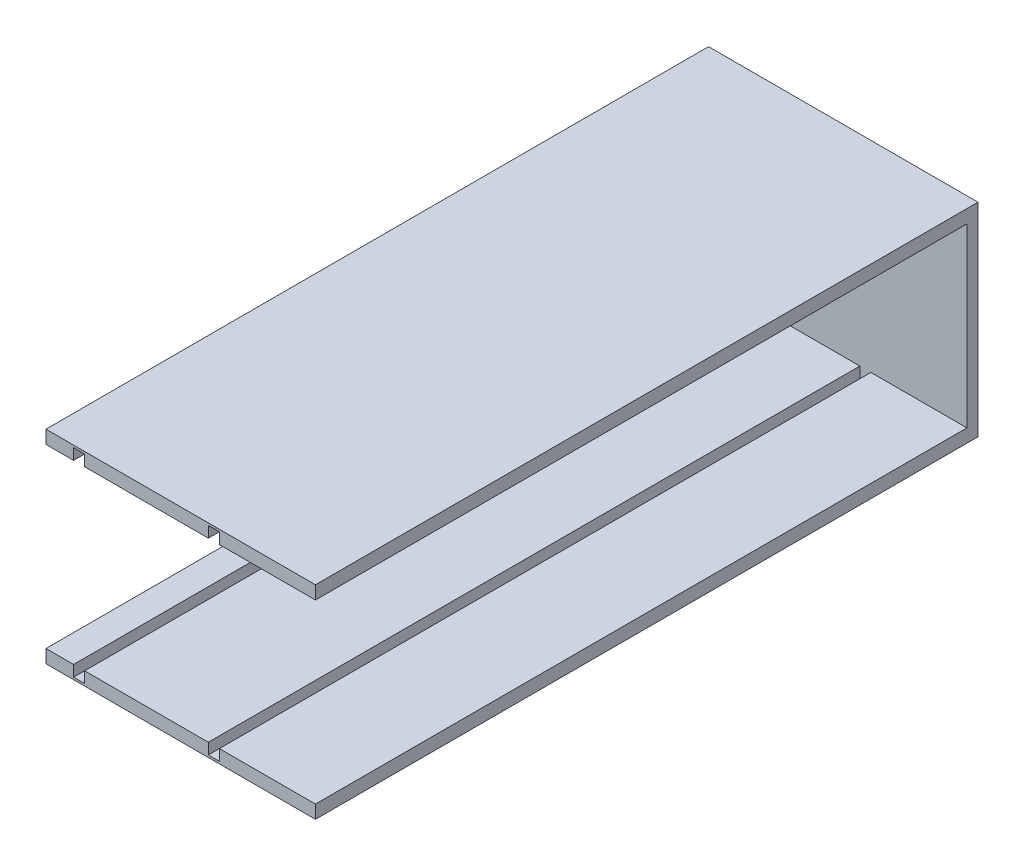
ISO-10303-21;
HEADER;
FILE_DESCRIPTION(('STEP AP214'),'2;1');
FILE_NAME('part.step','',(''),(''),'','','');
FILE_SCHEMA(('AUTOMOTIVE_DESIGN { 1 0 10303 214 1 1 1 1 }'));
ENDSEC;
DATA;
#1=APPLICATION_CONTEXT('core data for automotive mechanical design processes');
#2=APPLICATION_PROTOCOL_DEFINITION('international standard','automotive_design',2000,#1);
#3=PRODUCT_CONTEXT('',#1,'mechanical');
#4=PRODUCT('Part','Part','',(#3));
#5=PRODUCT_RELATED_PRODUCT_CATEGORY('part','',(#4));
#6=PRODUCT_DEFINITION_FORMATION('','',#4);
#7=PRODUCT_DEFINITION_CONTEXT('part definition',#1,'design');
#8=PRODUCT_DEFINITION('design','',#6,#7);
#9=PRODUCT_DEFINITION_SHAPE('','',#8);
#10=(LENGTH_UNIT() NAMED_UNIT(*) SI_UNIT(.MILLI.,.METRE.));
#11=(NAMED_UNIT(*) PLANE_ANGLE_UNIT() SI_UNIT($,.RADIAN.));
#12=(NAMED_UNIT(*) SI_UNIT($,.STERADIAN.) SOLID_ANGLE_UNIT());
#13=UNCERTAINTY_MEASURE_WITH_UNIT(LENGTH_MEASURE(1.E-05),#10,'distance_accuracy_value','');
#14=(GEOMETRIC_REPRESENTATION_CONTEXT(3) GLOBAL_UNCERTAINTY_ASSIGNED_CONTEXT((#13)) GLOBAL_UNIT_ASSIGNED_CONTEXT((#10,
#11,#12)) REPRESENTATION_CONTEXT('',''));
#15=CARTESIAN_POINT('',(0.,0.,0.));
#16=DIRECTION('',(0.,0.,1.));
#17=DIRECTION('',(1.,0.,0.));
#18=AXIS2_PLACEMENT_3D('',#15,#16,#17);
#19=CARTESIAN_POINT('',(0.,0.,25.));
#20=DIRECTION('',(0.,0.,1.));
#21=DIRECTION('',(1.,0.,0.));
#22=AXIS2_PLACEMENT_3D('',#19,#20,#21);
#23=PLANE('',#22);
#24=DIRECTION('',(0.,1.,0.));
#25=VECTOR('',#24,1.);
#26=CARTESIAN_POINT('',(-150.,0.,25.));
#27=LINE('',#26,#25);
#28=CARTESIAN_POINT('',(-150.,-430.,24.9999999999999));
#29=VERTEX_POINT('',#28);
#30=CARTESIAN_POINT('',(-150.,-29.9999999999999,24.9999999999999));
#31=VERTEX_POINT('',#30);
#32=EDGE_CURVE('E60',#29,#31,#27,.T.);
#33=ORIENTED_EDGE('',*,*,#32,.F.);
#34=DIRECTION('',(1.,0.,0.));
#35=VECTOR('',#34,1.);
#36=CARTESIAN_POINT('',(0.,-430.,25.));
#37=LINE('',#36,#35);
#38=CARTESIAN_POINT('',(-87.4999999999999,-430.,24.9999999999999));
#39=VERTEX_POINT('',#38);
#40=EDGE_CURVE('E11',#29,#39,#37,.T.);
#41=ORIENTED_EDGE('',*,*,#40,.T.);
#42=DIRECTION('',(0.,-1.,0.));
#43=VECTOR('',#42,1.);
#44=CARTESIAN_POINT('',(-87.4999999999999,0.,25.));
#45=LINE('',#44,#43);
#46=CARTESIAN_POINT('',(-87.4999999999999,-455.,24.9999999999999));
#47=VERTEX_POINT('',#46);
#48=EDGE_CURVE('E45',#39,#47,#45,.T.);
#49=ORIENTED_EDGE('',*,*,#48,.T.);
#50=DIRECTION('',(1.,0.,0.));
#51=VECTOR('',#50,1.);
#52=CARTESIAN_POINT('',(0.,-455.,25.));
#53=LINE('',#52,#51);
#54=CARTESIAN_POINT('',(-62.4999999999999,-455.,24.9999999999999));
#55=VERTEX_POINT('',#54);
#56=EDGE_CURVE('E343',#47,#55,#53,.T.);
#57=ORIENTED_EDGE('',*,*,#56,.T.);
#58=DIRECTION('',(0.,1.,0.));
#59=VECTOR('',#58,1.);
#60=CARTESIAN_POINT('',(-62.5000000000002,0.,25.));
#61=LINE('',#60,#59);
#62=CARTESIAN_POINT('',(-62.5,-430.,24.9999999999999));
#63=VERTEX_POINT('',#62);
#64=EDGE_CURVE('E223',#55,#63,#61,.T.);
#65=ORIENTED_EDGE('',*,*,#64,.T.);
#66=DIRECTION('',(1.,0.,0.));
#67=VECTOR('',#66,1.);
#68=CARTESIAN_POINT('',(3.81916720471054E-13,-430.,25.));
#69=LINE('',#68,#67);
#70=CARTESIAN_POINT('',(217.5,-430.,25.));
#71=VERTEX_POINT('',#70);
#72=EDGE_CURVE('E327',#63,#71,#69,.T.);
#73=ORIENTED_EDGE('',*,*,#72,.T.);
#74=DIRECTION('',(0.,-1.,0.));
#75=VECTOR('',#74,1.);
#76=CARTESIAN_POINT('',(217.5,0.,25.));
#77=LINE('',#76,#75);
#78=CARTESIAN_POINT('',(217.5,-455.,24.9999999999999));
#79=VERTEX_POINT('',#78);
#80=EDGE_CURVE('E330',#71,#79,#77,.T.);
#81=ORIENTED_EDGE('',*,*,#80,.T.);
#82=DIRECTION('',(1.,0.,0.));
#83=VECTOR('',#82,1.);
#84=CARTESIAN_POINT('',(0.,-455.,25.));
#85=LINE('',#84,#83);
#86=CARTESIAN_POINT('',(242.5,-455.,24.9999999999999));
#87=VERTEX_POINT('',#86);
#88=EDGE_CURVE('E333',#79,#87,#85,.T.);
#89=ORIENTED_EDGE('',*,*,#88,.T.);
#90=DIRECTION('',(0.,1.,0.));
#91=VECTOR('',#90,1.);
#92=CARTESIAN_POINT('',(242.5,0.,25.));
#93=LINE('',#92,#91);
#94=CARTESIAN_POINT('',(242.5,-430.,24.9999999999999));
#95=VERTEX_POINT('',#94);
#96=EDGE_CURVE('E336',#87,#95,#93,.T.);
#97=ORIENTED_EDGE('',*,*,#96,.T.);
#98=DIRECTION('',(1.,0.,0.));
#99=VECTOR('',#98,1.);
#100=CARTESIAN_POINT('',(0.,-430.,25.));
#101=LINE('',#100,#99);
#102=CARTESIAN_POINT('',(460.,-430.,24.9999999999999));
#103=VERTEX_POINT('',#102);
#104=EDGE_CURVE('E339',#95,#103,#101,.T.);
#105=ORIENTED_EDGE('',*,*,#104,.T.);
#106=DIRECTION('',(0.,-1.,0.));
#107=VECTOR('',#106,1.);
#108=CARTESIAN_POINT('',(460.,0.,25.));
#109=LINE('',#108,#107);
#110=CARTESIAN_POINT('',(460.,-30.,24.9999999999999));
#111=VERTEX_POINT('',#110);
#112=EDGE_CURVE('E233',#111,#103,#109,.T.);
#113=ORIENTED_EDGE('',*,*,#112,.F.);
#114=DIRECTION('',(1.,0.,0.));
#115=VECTOR('',#114,1.);
#116=CARTESIAN_POINT('',(242.5,-30.,24.9999999999999));
#117=LINE('',#116,#115);
#118=CARTESIAN_POINT('',(242.5,-30.,24.9999999999999));
#119=VERTEX_POINT('',#118);
#120=EDGE_CURVE('E240',#119,#111,#117,.T.);
#121=ORIENTED_EDGE('',*,*,#120,.F.);
#122=DIRECTION('',(0.,-1.,0.));
#123=VECTOR('',#122,1.);
#124=CARTESIAN_POINT('',(242.5,-5.00000000000004,24.9999999999999));
#125=LINE('',#124,#123);
#126=CARTESIAN_POINT('',(242.5,-5.00000000000004,24.9999999999999));
#127=VERTEX_POINT('',#126);
#128=EDGE_CURVE('E244',#127,#119,#125,.T.);
#129=ORIENTED_EDGE('',*,*,#128,.F.);
#130=DIRECTION('',(1.,0.,0.));
#131=VECTOR('',#130,1.);
#132=CARTESIAN_POINT('',(217.5,-5.00000000000004,24.9999999999999));
#133=LINE('',#132,#131);
#134=CARTESIAN_POINT('',(217.5,-5.00000000000004,24.9999999999999));
#135=VERTEX_POINT('',#134);
#136=EDGE_CURVE('E246',#135,#127,#133,.T.);
#137=ORIENTED_EDGE('',*,*,#136,.F.);
#138=DIRECTION('',(0.,1.,0.));
#139=VECTOR('',#138,1.);
#140=CARTESIAN_POINT('',(217.5,-30.,24.9999999999999));
#141=LINE('',#140,#139);
#142=CARTESIAN_POINT('',(217.5,-30.,24.9999999999999));
#143=VERTEX_POINT('',#142);
#144=EDGE_CURVE('E248',#143,#135,#141,.T.);
#145=ORIENTED_EDGE('',*,*,#144,.F.);
#146=DIRECTION('',(1.,0.,0.));
#147=VECTOR('',#146,1.);
#148=CARTESIAN_POINT('',(0.,-30.,24.9999999999999));
#149=LINE('',#148,#147);
#150=CARTESIAN_POINT('',(-62.5,-29.9999999999999,24.9999999999999));
#151=VERTEX_POINT('',#150);
#152=EDGE_CURVE('E250',#151,#143,#149,.T.);
#153=ORIENTED_EDGE('',*,*,#152,.F.);
#154=DIRECTION('',(0.,-1.,0.));
#155=VECTOR('',#154,1.);
#156=CARTESIAN_POINT('',(-62.5,-29.9999999999999,24.9999999999999));
#157=LINE('',#156,#155);
#158=CARTESIAN_POINT('',(-62.4999999999999,-4.99999999999995,24.9999999999999));
#159=VERTEX_POINT('',#158);
#160=EDGE_CURVE('E252',#159,#151,#157,.T.);
#161=ORIENTED_EDGE('',*,*,#160,.F.);
#162=DIRECTION('',(1.,0.,0.));
#163=VECTOR('',#162,1.);
#164=CARTESIAN_POINT('',(-62.4999999999999,-4.99999999999995,24.9999999999999));
#165=LINE('',#164,#163);
#166=CARTESIAN_POINT('',(-87.4999999999999,-4.99999999999995,24.9999999999999));
#167=VERTEX_POINT('',#166);
#168=EDGE_CURVE('E254',#167,#159,#165,.T.);
#169=ORIENTED_EDGE('',*,*,#168,.F.);
#170=DIRECTION('',(0.,1.,0.));
#171=VECTOR('',#170,1.);
#172=CARTESIAN_POINT('',(-87.4999999999999,-4.99999999999995,24.9999999999999));
#173=LINE('',#172,#171);
#174=CARTESIAN_POINT('',(-87.4999999999999,-29.9999999999999,24.9999999999999));
#175=VERTEX_POINT('',#174);
#176=EDGE_CURVE('E256',#175,#167,#173,.T.);
#177=ORIENTED_EDGE('',*,*,#176,.F.);
#178=DIRECTION('',(1.,0.,0.));
#179=VECTOR('',#178,1.);
#180=CARTESIAN_POINT('',(-150.,-29.9999999999999,24.9999999999999));
#181=LINE('',#180,#179);
#182=EDGE_CURVE('E258',#31,#175,#181,.T.);
#183=ORIENTED_EDGE('',*,*,#182,.F.);
#184=EDGE_LOOP('',(#33,#41,#49,#57,#65,#73,#81,#89,#97,#105,#113,#121,#129,#137,#145,#153,#161,
#169,#177,#183));
#185=FACE_BOUND('',#184,.T.);
#186=ADVANCED_FACE('F37',(#185),#23,.T.);
#187=CARTESIAN_POINT('',(-150.,0.,1500.));
#188=DIRECTION('',(1.,0.,0.));
#189=DIRECTION('',(0.,0.,-1.));
#190=AXIS2_PLACEMENT_3D('',#187,#188,#189);
#191=PLANE('',#190);
#192=DIRECTION('',(0.,0.,-1.));
#193=VECTOR('',#192,1.);
#194=CARTESIAN_POINT('',(-150.,-460.,25.));
#195=LINE('',#194,#193);
#196=CARTESIAN_POINT('',(-150.,-460.,1500.));
#197=VERTEX_POINT('',#196);
#198=CARTESIAN_POINT('',(-150.,-460.,0.));
#199=VERTEX_POINT('',#198);
#200=EDGE_CURVE('E237',#197,#199,#195,.T.);
#201=ORIENTED_EDGE('',*,*,#200,.F.);
#202=DIRECTION('',(0.,-1.,0.));
#203=VECTOR('',#202,1.);
#204=CARTESIAN_POINT('',(-150.,-460.,1500.));
#205=LINE('',#204,#203);
#206=CARTESIAN_POINT('',(-150.,-430.,1500.));
#207=VERTEX_POINT('',#206);
#208=EDGE_CURVE('E386',#207,#197,#205,.T.);
#209=ORIENTED_EDGE('',*,*,#208,.F.);
#210=DIRECTION('',(0.,0.,-1.));
#211=VECTOR('',#210,1.);
#212=CARTESIAN_POINT('',(-150.,-430.,1500.));
#213=LINE('',#212,#211);
#214=EDGE_CURVE('E355',#207,#29,#213,.T.);
#215=ORIENTED_EDGE('',*,*,#214,.T.);
#216=ORIENTED_EDGE('',*,*,#32,.T.);
#217=DIRECTION('',(0.,0.,-1.));
#218=VECTOR('',#217,1.);
#219=CARTESIAN_POINT('',(-150.,-29.9999999999999,1500.));
#220=LINE('',#219,#218);
#221=CARTESIAN_POINT('',(-150.,-29.9999999999999,1500.));
#222=VERTEX_POINT('',#221);
#223=EDGE_CURVE('E323',#222,#31,#220,.T.);
#224=ORIENTED_EDGE('',*,*,#223,.F.);
#225=DIRECTION('',(0.,-1.,0.));
#226=VECTOR('',#225,1.);
#227=CARTESIAN_POINT('',(-150.,0.,1500.));
#228=LINE('',#227,#226);
#229=CARTESIAN_POINT('',(-150.,0.,1500.));
#230=VERTEX_POINT('',#229);
#231=EDGE_CURVE('E264',#230,#222,#228,.T.);
#232=ORIENTED_EDGE('',*,*,#231,.F.);
#233=DIRECTION('',(0.,0.,-1.));
#234=VECTOR('',#233,1.);
#235=CARTESIAN_POINT('',(-150.,0.,1500.));
#236=LINE('',#235,#234);
#237=CARTESIAN_POINT('',(-150.,0.,0.));
#238=VERTEX_POINT('',#237);
#239=EDGE_CURVE('E325',#230,#238,#236,.T.);
#240=ORIENTED_EDGE('',*,*,#239,.T.);
#241=DIRECTION('',(0.,-1.,0.));
#242=VECTOR('',#241,1.);
#243=CARTESIAN_POINT('',(-150.,0.,0.));
#244=LINE('',#243,#242);
#245=EDGE_CURVE('E260',#238,#199,#244,.T.);
#246=ORIENTED_EDGE('',*,*,#245,.T.);
#247=EDGE_LOOP('',(#201,#209,#215,#216,#224,#232,#240,#246));
#248=FACE_BOUND('',#247,.T.);
#249=ADVANCED_FACE('F39',(#248),#191,.F.);
#250=CARTESIAN_POINT('',(-150.,-29.9999999999999,1500.));
#251=DIRECTION('',(0.,1.,0.));
#252=DIRECTION('',(0.,0.,1.));
#253=AXIS2_PLACEMENT_3D('',#250,#251,#252);
#254=PLANE('',#253);
#255=ORIENTED_EDGE('',*,*,#223,.T.);
#256=ORIENTED_EDGE('',*,*,#182,.T.);
#257=DIRECTION('',(0.,0.,-1.));
#258=VECTOR('',#257,1.);
#259=CARTESIAN_POINT('',(-87.4999999999999,-29.9999999999999,1500.));
#260=LINE('',#259,#258);
#261=CARTESIAN_POINT('',(-87.4999999999999,-29.9999999999999,1500.));
#262=VERTEX_POINT('',#261);
#263=EDGE_CURVE('E320',#262,#175,#260,.T.);
#264=ORIENTED_EDGE('',*,*,#263,.F.);
#265=DIRECTION('',(1.,0.,0.));
#266=VECTOR('',#265,1.);
#267=CARTESIAN_POINT('',(-150.,-29.9999999999999,1500.));
#268=LINE('',#267,#266);
#269=EDGE_CURVE('E267',#222,#262,#268,.T.);
#270=ORIENTED_EDGE('',*,*,#269,.F.);
#271=EDGE_LOOP('',(#255,#256,#264,#270));
#272=FACE_BOUND('',#271,.T.);
#273=ADVANCED_FACE('F469',(#272),#254,.F.);
#274=CARTESIAN_POINT('',(-87.4999999999999,-4.99999999999995,1500.));
#275=DIRECTION('',(-1.,0.,0.));
#276=DIRECTION('',(0.,0.,1.));
#277=AXIS2_PLACEMENT_3D('',#274,#275,#276);
#278=PLANE('',#277);
#279=ORIENTED_EDGE('',*,*,#263,.T.);
#280=ORIENTED_EDGE('',*,*,#176,.T.);
#281=DIRECTION('',(0.,0.,-1.));
#282=VECTOR('',#281,1.);
#283=CARTESIAN_POINT('',(-87.4999999999999,-4.99999999999995,1500.));
#284=LINE('',#283,#282);
#285=CARTESIAN_POINT('',(-87.4999999999999,-4.99999999999995,1500.));
#286=VERTEX_POINT('',#285);
#287=EDGE_CURVE('E317',#286,#167,#284,.T.);
#288=ORIENTED_EDGE('',*,*,#287,.F.);
#289=DIRECTION('',(0.,1.,0.));
#290=VECTOR('',#289,1.);
#291=CARTESIAN_POINT('',(-87.4999999999999,-4.99999999999995,1500.));
#292=LINE('',#291,#290);
#293=EDGE_CURVE('E269',#262,#286,#292,.T.);
#294=ORIENTED_EDGE('',*,*,#293,.F.);
#295=EDGE_LOOP('',(#279,#280,#288,#294));
#296=FACE_BOUND('',#295,.T.);
#297=ADVANCED_FACE('F465',(#296),#278,.F.);
#298=CARTESIAN_POINT('',(-62.4999999999999,-4.99999999999995,1500.));
#299=DIRECTION('',(0.,1.,0.));
#300=DIRECTION('',(0.,0.,1.));
#301=AXIS2_PLACEMENT_3D('',#298,#299,#300);
#302=PLANE('',#301);
#303=ORIENTED_EDGE('',*,*,#287,.T.);
#304=ORIENTED_EDGE('',*,*,#168,.T.);
#305=DIRECTION('',(0.,0.,-1.));
#306=VECTOR('',#305,1.);
#307=CARTESIAN_POINT('',(-62.4999999999999,-4.99999999999995,1500.));
#308=LINE('',#307,#306);
#309=CARTESIAN_POINT('',(-62.4999999999999,-4.99999999999995,1500.));
#310=VERTEX_POINT('',#309);
#311=EDGE_CURVE('E314',#310,#159,#308,.T.);
#312=ORIENTED_EDGE('',*,*,#311,.F.);
#313=DIRECTION('',(1.,0.,0.));
#314=VECTOR('',#313,1.);
#315=CARTESIAN_POINT('',(-62.4999999999999,-4.99999999999995,1500.));
#316=LINE('',#315,#314);
#317=EDGE_CURVE('E271',#286,#310,#316,.T.);
#318=ORIENTED_EDGE('',*,*,#317,.F.);
#319=EDGE_LOOP('',(#303,#304,#312,#318));
#320=FACE_BOUND('',#319,.T.);
#321=ADVANCED_FACE('F460',(#320),#302,.F.);
#322=CARTESIAN_POINT('',(-62.5,-29.9999999999999,1500.));
#323=DIRECTION('',(1.,0.,0.));
#324=DIRECTION('',(0.,1.,0.));
#325=AXIS2_PLACEMENT_3D('',#322,#323,#324);
#326=PLANE('',#325);
#327=ORIENTED_EDGE('',*,*,#311,.T.);
#328=ORIENTED_EDGE('',*,*,#160,.T.);
#329=DIRECTION('',(0.,0.,-1.));
#330=VECTOR('',#329,1.);
#331=CARTESIAN_POINT('',(-62.5,-29.9999999999999,1500.));
#332=LINE('',#331,#330);
#333=CARTESIAN_POINT('',(-62.5,-29.9999999999999,1500.));
#334=VERTEX_POINT('',#333);
#335=EDGE_CURVE('E311',#334,#151,#332,.T.);
#336=ORIENTED_EDGE('',*,*,#335,.F.);
#337=DIRECTION('',(0.,-1.,0.));
#338=VECTOR('',#337,1.);
#339=CARTESIAN_POINT('',(-62.5,-29.9999999999999,1500.));
#340=LINE('',#339,#338);
#341=EDGE_CURVE('E273',#310,#334,#340,.T.);
#342=ORIENTED_EDGE('',*,*,#341,.F.);
#343=EDGE_LOOP('',(#327,#328,#336,#342));
#344=FACE_BOUND('',#343,.T.);
#345=ADVANCED_FACE('F454',(#344),#326,.F.);
#346=CARTESIAN_POINT('',(0.,-30.,1500.));
#347=DIRECTION('',(0.,1.,0.));
#348=DIRECTION('',(-1.,0.,0.));
#349=AXIS2_PLACEMENT_3D('',#346,#347,#348);
#350=PLANE('',#349);
#351=ORIENTED_EDGE('',*,*,#335,.T.);
#352=ORIENTED_EDGE('',*,*,#152,.T.);
#353=DIRECTION('',(0.,0.,-1.));
#354=VECTOR('',#353,1.);
#355=CARTESIAN_POINT('',(217.5,-30.,1500.));
#356=LINE('',#355,#354);
#357=CARTESIAN_POINT('',(217.5,-30.,1500.));
#358=VERTEX_POINT('',#357);
#359=EDGE_CURVE('E308',#358,#143,#356,.T.);
#360=ORIENTED_EDGE('',*,*,#359,.F.);
#361=DIRECTION('',(1.,0.,0.));
#362=VECTOR('',#361,1.);
#363=CARTESIAN_POINT('',(-62.5,-29.9999999999999,1500.));
#364=LINE('',#363,#362);
#365=EDGE_CURVE('E275',#334,#358,#364,.T.);
#366=ORIENTED_EDGE('',*,*,#365,.F.);
#367=EDGE_LOOP('',(#351,#352,#360,#366));
#368=FACE_BOUND('',#367,.T.);
#369=ADVANCED_FACE('F450',(#368),#350,.F.);
#370=CARTESIAN_POINT('',(217.5,-30.,1500.));
#371=DIRECTION('',(-1.,0.,0.));
#372=DIRECTION('',(0.,0.,1.));
#373=AXIS2_PLACEMENT_3D('',#370,#371,#372);
#374=PLANE('',#373);
#375=ORIENTED_EDGE('',*,*,#359,.T.);
#376=ORIENTED_EDGE('',*,*,#144,.T.);
#377=DIRECTION('',(0.,0.,-1.));
#378=VECTOR('',#377,1.);
#379=CARTESIAN_POINT('',(217.5,-5.00000000000004,1500.));
#380=LINE('',#379,#378);
#381=CARTESIAN_POINT('',(217.5,-5.00000000000004,1500.));
#382=VERTEX_POINT('',#381);
#383=EDGE_CURVE('E305',#382,#135,#380,.T.);
#384=ORIENTED_EDGE('',*,*,#383,.F.);
#385=DIRECTION('',(0.,1.,0.));
#386=VECTOR('',#385,1.);
#387=CARTESIAN_POINT('',(217.5,-30.,1500.));
#388=LINE('',#387,#386);
#389=EDGE_CURVE('E277',#358,#382,#388,.T.);
#390=ORIENTED_EDGE('',*,*,#389,.F.);
#391=EDGE_LOOP('',(#375,#376,#384,#390));
#392=FACE_BOUND('',#391,.T.);
#393=ADVANCED_FACE('F445',(#392),#374,.F.);
#394=CARTESIAN_POINT('',(217.5,-5.00000000000004,1500.));
#395=DIRECTION('',(0.,1.,0.));
#396=DIRECTION('',(-1.,0.,0.));
#397=AXIS2_PLACEMENT_3D('',#394,#395,#396);
#398=PLANE('',#397);
#399=ORIENTED_EDGE('',*,*,#383,.T.);
#400=ORIENTED_EDGE('',*,*,#136,.T.);
#401=DIRECTION('',(0.,0.,-1.));
#402=VECTOR('',#401,1.);
#403=CARTESIAN_POINT('',(242.5,-5.00000000000004,1500.));
#404=LINE('',#403,#402);
#405=CARTESIAN_POINT('',(242.5,-5.00000000000004,1500.));
#406=VERTEX_POINT('',#405);
#407=EDGE_CURVE('E302',#406,#127,#404,.T.);
#408=ORIENTED_EDGE('',*,*,#407,.F.);
#409=DIRECTION('',(1.,0.,0.));
#410=VECTOR('',#409,1.);
#411=CARTESIAN_POINT('',(217.5,-5.00000000000004,1500.));
#412=LINE('',#411,#410);
#413=EDGE_CURVE('E279',#382,#406,#412,.T.);
#414=ORIENTED_EDGE('',*,*,#413,.F.);
#415=EDGE_LOOP('',(#399,#400,#408,#414));
#416=FACE_BOUND('',#415,.T.);
#417=ADVANCED_FACE('F439',(#416),#398,.F.);
#418=CARTESIAN_POINT('',(242.5,-5.00000000000004,1500.));
#419=DIRECTION('',(1.,0.,0.));
#420=DIRECTION('',(0.,0.,-1.));
#421=AXIS2_PLACEMENT_3D('',#418,#419,#420);
#422=PLANE('',#421);
#423=ORIENTED_EDGE('',*,*,#407,.T.);
#424=ORIENTED_EDGE('',*,*,#128,.T.);
#425=DIRECTION('',(0.,0.,-1.));
#426=VECTOR('',#425,1.);
#427=CARTESIAN_POINT('',(242.5,-30.,1500.));
#428=LINE('',#427,#426);
#429=CARTESIAN_POINT('',(242.5,-30.,1500.));
#430=VERTEX_POINT('',#429);
#431=EDGE_CURVE('E299',#430,#119,#428,.T.);
#432=ORIENTED_EDGE('',*,*,#431,.F.);
#433=DIRECTION('',(0.,-1.,0.));
#434=VECTOR('',#433,1.);
#435=CARTESIAN_POINT('',(242.5,-5.00000000000004,1500.));
#436=LINE('',#435,#434);
#437=EDGE_CURVE('E281',#406,#430,#436,.T.);
#438=ORIENTED_EDGE('',*,*,#437,.F.);
#439=EDGE_LOOP('',(#423,#424,#432,#438));
#440=FACE_BOUND('',#439,.T.);
#441=ADVANCED_FACE('F437',(#440),#422,.F.);
#442=CARTESIAN_POINT('',(242.5,-30.,1500.));
#443=DIRECTION('',(0.,1.,0.));
#444=DIRECTION('',(0.,0.,1.));
#445=AXIS2_PLACEMENT_3D('',#442,#443,#444);
#446=PLANE('',#445);
#447=ORIENTED_EDGE('',*,*,#431,.T.);
#448=ORIENTED_EDGE('',*,*,#120,.T.);
#449=DIRECTION('',(0.,0.,-1.));
#450=VECTOR('',#449,1.);
#451=CARTESIAN_POINT('',(460.,-30.,1500.));
#452=LINE('',#451,#450);
#453=CARTESIAN_POINT('',(460.,-30.,1500.));
#454=VERTEX_POINT('',#453);
#455=EDGE_CURVE('E296',#454,#111,#452,.T.);
#456=ORIENTED_EDGE('',*,*,#455,.F.);
#457=DIRECTION('',(1.,0.,0.));
#458=VECTOR('',#457,1.);
#459=CARTESIAN_POINT('',(242.5,-30.,1500.));
#460=LINE('',#459,#458);
#461=EDGE_CURVE('E283',#430,#454,#460,.T.);
#462=ORIENTED_EDGE('',*,*,#461,.F.);
#463=EDGE_LOOP('',(#447,#448,#456,#462));
#464=FACE_BOUND('',#463,.T.);
#465=ADVANCED_FACE('F426',(#464),#446,.F.);
#466=CARTESIAN_POINT('',(460.,0.,1500.));
#467=DIRECTION('',(-1.,0.,0.));
#468=DIRECTION('',(0.,0.,1.));
#469=AXIS2_PLACEMENT_3D('',#466,#467,#468);
#470=PLANE('',#469);
#471=DIRECTION('',(0.,1.,0.));
#472=VECTOR('',#471,1.);
#473=CARTESIAN_POINT('',(460.,0.,0.));
#474=LINE('',#473,#472);
#475=CARTESIAN_POINT('',(460.,-460.,0.));
#476=VERTEX_POINT('',#475);
#477=CARTESIAN_POINT('',(460.,0.,0.));
#478=VERTEX_POINT('',#477);
#479=EDGE_CURVE('E290',#476,#478,#474,.T.);
#480=ORIENTED_EDGE('',*,*,#479,.T.);
#481=DIRECTION('',(0.,0.,-1.));
#482=VECTOR('',#481,1.);
#483=CARTESIAN_POINT('',(460.,0.,1500.));
#484=LINE('',#483,#482);
#485=CARTESIAN_POINT('',(460.,0.,1500.));
#486=VERTEX_POINT('',#485);
#487=EDGE_CURVE('E288',#486,#478,#484,.T.);
#488=ORIENTED_EDGE('',*,*,#487,.F.);
#489=DIRECTION('',(0.,1.,0.));
#490=VECTOR('',#489,1.);
#491=CARTESIAN_POINT('',(460.,0.,1500.));
#492=LINE('',#491,#490);
#493=EDGE_CURVE('E285',#454,#486,#492,.T.);
#494=ORIENTED_EDGE('',*,*,#493,.F.);
#495=ORIENTED_EDGE('',*,*,#455,.T.);
#496=ORIENTED_EDGE('',*,*,#112,.T.);
#497=DIRECTION('',(0.,0.,-1.));
#498=VECTOR('',#497,1.);
#499=CARTESIAN_POINT('',(460.,-430.,1500.));
#500=LINE('',#499,#498);
#501=CARTESIAN_POINT('',(460.,-430.,1500.));
#502=VERTEX_POINT('',#501);
#503=EDGE_CURVE('E356',#502,#103,#500,.T.);
#504=ORIENTED_EDGE('',*,*,#503,.F.);
#505=DIRECTION('',(0.,1.,0.));
#506=VECTOR('',#505,1.);
#507=CARTESIAN_POINT('',(460.,-460.,1500.));
#508=LINE('',#507,#506);
#509=CARTESIAN_POINT('',(460.,-460.,1500.));
#510=VERTEX_POINT('',#509);
#511=EDGE_CURVE('E381',#510,#502,#508,.T.);
#512=ORIENTED_EDGE('',*,*,#511,.F.);
#513=DIRECTION('',(0.,0.,-1.));
#514=VECTOR('',#513,1.);
#515=CARTESIAN_POINT('',(460.,-460.,25.));
#516=LINE('',#515,#514);
#517=EDGE_CURVE('E235',#510,#476,#516,.T.);
#518=ORIENTED_EDGE('',*,*,#517,.T.);
#519=EDGE_LOOP('',(#480,#488,#494,#495,#496,#504,#512,#518));
#520=FACE_BOUND('',#519,.T.);
#521=ADVANCED_FACE('F402',(#520),#470,.F.);
#522=CARTESIAN_POINT('',(0.,0.,1500.));
#523=DIRECTION('',(0.,-1.,0.));
#524=DIRECTION('',(0.,0.,-1.));
#525=AXIS2_PLACEMENT_3D('',#522,#523,#524);
#526=PLANE('',#525);
#527=ORIENTED_EDGE('',*,*,#487,.T.);
#528=DIRECTION('',(-1.,0.,0.));
#529=VECTOR('',#528,1.);
#530=CARTESIAN_POINT('',(0.,0.,0.));
#531=LINE('',#530,#529);
#532=EDGE_CURVE('E265',#478,#238,#531,.T.);
#533=ORIENTED_EDGE('',*,*,#532,.T.);
#534=ORIENTED_EDGE('',*,*,#239,.F.);
#535=DIRECTION('',(-1.,0.,0.));
#536=VECTOR('',#535,1.);
#537=CARTESIAN_POINT('',(0.,0.,1500.));
#538=LINE('',#537,#536);
#539=EDGE_CURVE('E261',#486,#230,#538,.T.);
#540=ORIENTED_EDGE('',*,*,#539,.F.);
#541=EDGE_LOOP('',(#527,#533,#534,#540));
#542=FACE_BOUND('',#541,.T.);
#543=ADVANCED_FACE('F471',(#542),#526,.F.);
#544=CARTESIAN_POINT('',(0.,0.,1500.));
#545=DIRECTION('',(0.,0.,1.));
#546=DIRECTION('',(1.,0.,0.));
#547=AXIS2_PLACEMENT_3D('',#544,#545,#546);
#548=PLANE('',#547);
#549=ORIENTED_EDGE('',*,*,#539,.T.);
#550=ORIENTED_EDGE('',*,*,#231,.T.);
#551=ORIENTED_EDGE('',*,*,#269,.T.);
#552=ORIENTED_EDGE('',*,*,#293,.T.);
#553=ORIENTED_EDGE('',*,*,#317,.T.);
#554=ORIENTED_EDGE('',*,*,#341,.T.);
#555=ORIENTED_EDGE('',*,*,#365,.T.);
#556=ORIENTED_EDGE('',*,*,#389,.T.);
#557=ORIENTED_EDGE('',*,*,#413,.T.);
#558=ORIENTED_EDGE('',*,*,#437,.T.);
#559=ORIENTED_EDGE('',*,*,#461,.T.);
#560=ORIENTED_EDGE('',*,*,#493,.T.);
#561=EDGE_LOOP('',(#549,#550,#551,#552,#553,#554,#555,#556,#557,#558,#559,#560));
#562=FACE_BOUND('',#561,.T.);
#563=ADVANCED_FACE('F431',(#562),#548,.T.);
#564=CARTESIAN_POINT('',(0.,0.,0.));
#565=DIRECTION('',(0.,0.,1.));
#566=DIRECTION('',(1.,0.,0.));
#567=AXIS2_PLACEMENT_3D('',#564,#565,#566);
#568=PLANE('',#567);
#569=ORIENTED_EDGE('',*,*,#532,.F.);
#570=ORIENTED_EDGE('',*,*,#479,.F.);
#571=DIRECTION('',(-1.,0.,0.));
#572=VECTOR('',#571,1.);
#573=CARTESIAN_POINT('',(-150.,-460.,0.));
#574=LINE('',#573,#572);
#575=EDGE_CURVE('E224',#476,#199,#574,.T.);
#576=ORIENTED_EDGE('',*,*,#575,.T.);
#577=ORIENTED_EDGE('',*,*,#245,.F.);
#578=EDGE_LOOP('',(#569,#570,#576,#577));
#579=FACE_BOUND('',#578,.T.);
#580=ADVANCED_FACE('F398',(#579),#568,.F.);
#581=CARTESIAN_POINT('',(-150.,-460.,25.));
#582=DIRECTION('',(0.,-1.,0.));
#583=DIRECTION('',(0.,0.,-1.));
#584=AXIS2_PLACEMENT_3D('',#581,#582,#583);
#585=PLANE('',#584);
#586=ORIENTED_EDGE('',*,*,#575,.F.);
#587=ORIENTED_EDGE('',*,*,#517,.F.);
#588=DIRECTION('',(1.,0.,0.));
#589=VECTOR('',#588,1.);
#590=CARTESIAN_POINT('',(0.,-460.,1500.));
#591=LINE('',#590,#589);
#592=EDGE_CURVE('E383',#197,#510,#591,.T.);
#593=ORIENTED_EDGE('',*,*,#592,.F.);
#594=ORIENTED_EDGE('',*,*,#200,.T.);
#595=EDGE_LOOP('',(#586,#587,#593,#594));
#596=FACE_BOUND('',#595,.T.);
#597=ADVANCED_FACE('F395',(#596),#585,.T.);
#598=CARTESIAN_POINT('',(-62.5,-430.,1500.));
#599=DIRECTION('',(1.,0.,0.));
#600=DIRECTION('',(0.,1.,0.));
#601=AXIS2_PLACEMENT_3D('',#598,#599,#600);
#602=PLANE('',#601);
#603=ORIENTED_EDGE('',*,*,#64,.F.);
#604=DIRECTION('',(0.,0.,-1.));
#605=VECTOR('',#604,1.);
#606=CARTESIAN_POINT('',(-62.4999999999999,-455.,1500.));
#607=LINE('',#606,#605);
#608=CARTESIAN_POINT('',(-62.4999999999999,-455.,1500.));
#609=VERTEX_POINT('',#608);
#610=EDGE_CURVE('E205',#609,#55,#607,.T.);
#611=ORIENTED_EDGE('',*,*,#610,.F.);
#612=DIRECTION('',(0.,-1.,0.));
#613=VECTOR('',#612,1.);
#614=CARTESIAN_POINT('',(-62.5,-430.,1500.));
#615=LINE('',#614,#613);
#616=CARTESIAN_POINT('',(-62.5,-430.,1500.));
#617=VERTEX_POINT('',#616);
#618=EDGE_CURVE('E212',#617,#609,#615,.T.);
#619=ORIENTED_EDGE('',*,*,#618,.F.);
#620=DIRECTION('',(0.,0.,-1.));
#621=VECTOR('',#620,1.);
#622=CARTESIAN_POINT('',(-62.5,-430.,1500.));
#623=LINE('',#622,#621);
#624=EDGE_CURVE('E370',#617,#63,#623,.T.);
#625=ORIENTED_EDGE('',*,*,#624,.T.);
#626=EDGE_LOOP('',(#603,#611,#619,#625));
#627=FACE_BOUND('',#626,.T.);
#628=ADVANCED_FACE('F221',(#627),#602,.F.);
#629=CARTESIAN_POINT('',(-62.4999999999999,-455.,1500.));
#630=DIRECTION('',(0.,-1.,0.));
#631=DIRECTION('',(0.,0.,-1.));
#632=AXIS2_PLACEMENT_3D('',#629,#630,#631);
#633=PLANE('',#632);
#634=ORIENTED_EDGE('',*,*,#56,.F.);
#635=DIRECTION('',(0.,0.,-1.));
#636=VECTOR('',#635,1.);
#637=CARTESIAN_POINT('',(-87.4999999999999,-455.,1500.));
#638=LINE('',#637,#636);
#639=CARTESIAN_POINT('',(-87.4999999999999,-455.,1500.));
#640=VERTEX_POINT('',#639);
#641=EDGE_CURVE('E208',#640,#47,#638,.T.);
#642=ORIENTED_EDGE('',*,*,#641,.F.);
#643=DIRECTION('',(-1.,0.,0.));
#644=VECTOR('',#643,1.);
#645=CARTESIAN_POINT('',(-62.4999999999999,-455.,1500.));
#646=LINE('',#645,#644);
#647=EDGE_CURVE('E201',#609,#640,#646,.T.);
#648=ORIENTED_EDGE('',*,*,#647,.F.);
#649=ORIENTED_EDGE('',*,*,#610,.T.);
#650=EDGE_LOOP('',(#634,#642,#648,#649));
#651=FACE_BOUND('',#650,.T.);
#652=ADVANCED_FACE('F203',(#651),#633,.F.);
#653=CARTESIAN_POINT('',(-87.4999999999999,-455.,1500.));
#654=DIRECTION('',(-1.,0.,0.));
#655=DIRECTION('',(0.,0.,1.));
#656=AXIS2_PLACEMENT_3D('',#653,#654,#655);
#657=PLANE('',#656);
#658=ORIENTED_EDGE('',*,*,#48,.F.);
#659=DIRECTION('',(0.,0.,-1.));
#660=VECTOR('',#659,1.);
#661=CARTESIAN_POINT('',(-87.4999999999999,-430.,1500.));
#662=LINE('',#661,#660);
#663=CARTESIAN_POINT('',(-87.4999999999999,-430.,1500.));
#664=VERTEX_POINT('',#663);
#665=EDGE_CURVE('E228',#664,#39,#662,.T.);
#666=ORIENTED_EDGE('',*,*,#665,.F.);
#667=DIRECTION('',(0.,1.,0.));
#668=VECTOR('',#667,1.);
#669=CARTESIAN_POINT('',(-87.4999999999999,-455.,1500.));
#670=LINE('',#669,#668);
#671=EDGE_CURVE('E211',#640,#664,#670,.T.);
#672=ORIENTED_EDGE('',*,*,#671,.F.);
#673=ORIENTED_EDGE('',*,*,#641,.T.);
#674=EDGE_LOOP('',(#658,#666,#672,#673));
#675=FACE_BOUND('',#674,.T.);
#676=ADVANCED_FACE('F349',(#675),#657,.F.);
#677=CARTESIAN_POINT('',(-150.,-430.,1500.));
#678=DIRECTION('',(0.,-1.,0.));
#679=DIRECTION('',(0.,0.,-1.));
#680=AXIS2_PLACEMENT_3D('',#677,#678,#679);
#681=PLANE('',#680);
#682=ORIENTED_EDGE('',*,*,#40,.F.);
#683=ORIENTED_EDGE('',*,*,#214,.F.);
#684=DIRECTION('',(-1.,0.,0.));
#685=VECTOR('',#684,1.);
#686=CARTESIAN_POINT('',(-150.,-430.,1500.));
#687=LINE('',#686,#685);
#688=EDGE_CURVE('E354',#664,#207,#687,.T.);
#689=ORIENTED_EDGE('',*,*,#688,.F.);
#690=ORIENTED_EDGE('',*,*,#665,.T.);
#691=EDGE_LOOP('',(#682,#683,#689,#690));
#692=FACE_BOUND('',#691,.T.);
#693=ADVANCED_FACE('F352',(#692),#681,.F.);
#694=CARTESIAN_POINT('',(242.5,-430.,1500.));
#695=DIRECTION('',(0.,-1.,0.));
#696=DIRECTION('',(0.,0.,-1.));
#697=AXIS2_PLACEMENT_3D('',#694,#695,#696);
#698=PLANE('',#697);
#699=ORIENTED_EDGE('',*,*,#104,.F.);
#700=DIRECTION('',(0.,0.,-1.));
#701=VECTOR('',#700,1.);
#702=CARTESIAN_POINT('',(242.5,-430.,1500.));
#703=LINE('',#702,#701);
#704=CARTESIAN_POINT('',(242.5,-430.,1500.));
#705=VERTEX_POINT('',#704);
#706=EDGE_CURVE('E360',#705,#95,#703,.T.);
#707=ORIENTED_EDGE('',*,*,#706,.F.);
#708=DIRECTION('',(-1.,0.,0.));
#709=VECTOR('',#708,1.);
#710=CARTESIAN_POINT('',(242.5,-430.,1500.));
#711=LINE('',#710,#709);
#712=EDGE_CURVE('E379',#502,#705,#711,.T.);
#713=ORIENTED_EDGE('',*,*,#712,.F.);
#714=ORIENTED_EDGE('',*,*,#503,.T.);
#715=EDGE_LOOP('',(#699,#707,#713,#714));
#716=FACE_BOUND('',#715,.T.);
#717=ADVANCED_FACE('F408',(#716),#698,.F.);
#718=CARTESIAN_POINT('',(242.5,-455.,1500.));
#719=DIRECTION('',(1.,0.,0.));
#720=DIRECTION('',(0.,0.,-1.));
#721=AXIS2_PLACEMENT_3D('',#718,#719,#720);
#722=PLANE('',#721);
#723=ORIENTED_EDGE('',*,*,#96,.F.);
#724=DIRECTION('',(0.,0.,-1.));
#725=VECTOR('',#724,1.);
#726=CARTESIAN_POINT('',(242.5,-455.,1500.));
#727=LINE('',#726,#725);
#728=CARTESIAN_POINT('',(242.5,-455.,1500.));
#729=VERTEX_POINT('',#728);
#730=EDGE_CURVE('E363',#729,#87,#727,.T.);
#731=ORIENTED_EDGE('',*,*,#730,.F.);
#732=DIRECTION('',(0.,-1.,0.));
#733=VECTOR('',#732,1.);
#734=CARTESIAN_POINT('',(242.5,-455.,1500.));
#735=LINE('',#734,#733);
#736=EDGE_CURVE('E377',#705,#729,#735,.T.);
#737=ORIENTED_EDGE('',*,*,#736,.F.);
#738=ORIENTED_EDGE('',*,*,#706,.T.);
#739=EDGE_LOOP('',(#723,#731,#737,#738));
#740=FACE_BOUND('',#739,.T.);
#741=ADVANCED_FACE('F412',(#740),#722,.F.);
#742=CARTESIAN_POINT('',(217.5,-455.,1500.));
#743=DIRECTION('',(0.,-1.,0.));
#744=DIRECTION('',(0.,0.,-1.));
#745=AXIS2_PLACEMENT_3D('',#742,#743,#744);
#746=PLANE('',#745);
#747=ORIENTED_EDGE('',*,*,#88,.F.);
#748=DIRECTION('',(0.,0.,-1.));
#749=VECTOR('',#748,1.);
#750=CARTESIAN_POINT('',(217.5,-455.,1500.));
#751=LINE('',#750,#749);
#752=CARTESIAN_POINT('',(217.5,-455.,1500.));
#753=VERTEX_POINT('',#752);
#754=EDGE_CURVE('E366',#753,#79,#751,.T.);
#755=ORIENTED_EDGE('',*,*,#754,.F.);
#756=DIRECTION('',(-1.,0.,0.));
#757=VECTOR('',#756,1.);
#758=CARTESIAN_POINT('',(217.5,-455.,1500.));
#759=LINE('',#758,#757);
#760=EDGE_CURVE('E375',#729,#753,#759,.T.);
#761=ORIENTED_EDGE('',*,*,#760,.F.);
#762=ORIENTED_EDGE('',*,*,#730,.T.);
#763=EDGE_LOOP('',(#747,#755,#761,#762));
#764=FACE_BOUND('',#763,.T.);
#765=ADVANCED_FACE('F417',(#764),#746,.F.);
#766=CARTESIAN_POINT('',(217.5,-430.,1500.));
#767=DIRECTION('',(-1.,0.,0.));
#768=DIRECTION('',(0.,0.,1.));
#769=AXIS2_PLACEMENT_3D('',#766,#767,#768);
#770=PLANE('',#769);
#771=ORIENTED_EDGE('',*,*,#80,.F.);
#772=DIRECTION('',(0.,0.,-1.));
#773=VECTOR('',#772,1.);
#774=CARTESIAN_POINT('',(217.5,-430.,1500.));
#775=LINE('',#774,#773);
#776=CARTESIAN_POINT('',(217.5,-430.,1500.));
#777=VERTEX_POINT('',#776);
#778=EDGE_CURVE('E52',#777,#71,#775,.T.);
#779=ORIENTED_EDGE('',*,*,#778,.F.);
#780=DIRECTION('',(0.,1.,0.));
#781=VECTOR('',#780,1.);
#782=CARTESIAN_POINT('',(217.5,-430.,1500.));
#783=LINE('',#782,#781);
#784=EDGE_CURVE('E373',#753,#777,#783,.T.);
#785=ORIENTED_EDGE('',*,*,#784,.F.);
#786=ORIENTED_EDGE('',*,*,#754,.T.);
#787=EDGE_LOOP('',(#771,#779,#785,#786));
#788=FACE_BOUND('',#787,.T.);
#789=ADVANCED_FACE('F419',(#788),#770,.F.);
#790=CARTESIAN_POINT('',(-62.5,-430.,1500.));
#791=DIRECTION('',(0.,-1.,0.));
#792=DIRECTION('',(1.,0.,0.));
#793=AXIS2_PLACEMENT_3D('',#790,#791,#792);
#794=PLANE('',#793);
#795=ORIENTED_EDGE('',*,*,#72,.F.);
#796=ORIENTED_EDGE('',*,*,#624,.F.);
#797=DIRECTION('',(-1.,0.,0.));
#798=VECTOR('',#797,1.);
#799=CARTESIAN_POINT('',(0.,-430.,1500.));
#800=LINE('',#799,#798);
#801=EDGE_CURVE('E216',#777,#617,#800,.T.);
#802=ORIENTED_EDGE('',*,*,#801,.F.);
#803=ORIENTED_EDGE('',*,*,#778,.T.);
#804=EDGE_LOOP('',(#795,#796,#802,#803));
#805=FACE_BOUND('',#804,.T.);
#806=ADVANCED_FACE('F420',(#805),#794,.F.);
#807=CARTESIAN_POINT('',(0.,0.,1500.));
#808=DIRECTION('',(0.,0.,-1.));
#809=DIRECTION('',(-1.,0.,0.));
#810=AXIS2_PLACEMENT_3D('',#807,#808,#809);
#811=PLANE('',#810);
#812=ORIENTED_EDGE('',*,*,#618,.T.);
#813=ORIENTED_EDGE('',*,*,#647,.T.);
#814=ORIENTED_EDGE('',*,*,#671,.T.);
#815=ORIENTED_EDGE('',*,*,#688,.T.);
#816=ORIENTED_EDGE('',*,*,#208,.T.);
#817=ORIENTED_EDGE('',*,*,#592,.T.);
#818=ORIENTED_EDGE('',*,*,#511,.T.);
#819=ORIENTED_EDGE('',*,*,#712,.T.);
#820=ORIENTED_EDGE('',*,*,#736,.T.);
#821=ORIENTED_EDGE('',*,*,#760,.T.);
#822=ORIENTED_EDGE('',*,*,#784,.T.);
#823=ORIENTED_EDGE('',*,*,#801,.T.);
#824=EDGE_LOOP('',(#812,#813,#814,#815,#816,#817,#818,#819,#820,#821,#822,#823));
#825=FACE_BOUND('',#824,.T.);
#826=ADVANCED_FACE('F215',(#825),#811,.F.);
#827=CLOSED_SHELL('',(#186,#249,#273,#297,#321,#345,#369,#393,#417,#441,#465,#521,#543,#563,
#580,#597,#628,#652,#676,#693,#717,#741,#765,#789,#806,#826));
#828=MANIFOLD_SOLID_BREP('B2',#827);
#829=ADVANCED_BREP_SHAPE_REPRESENTATION('',(#18,#828),#14);
#830=SHAPE_DEFINITION_REPRESENTATION(#9,#829);
ENDSEC;
END-ISO-10303-21;
